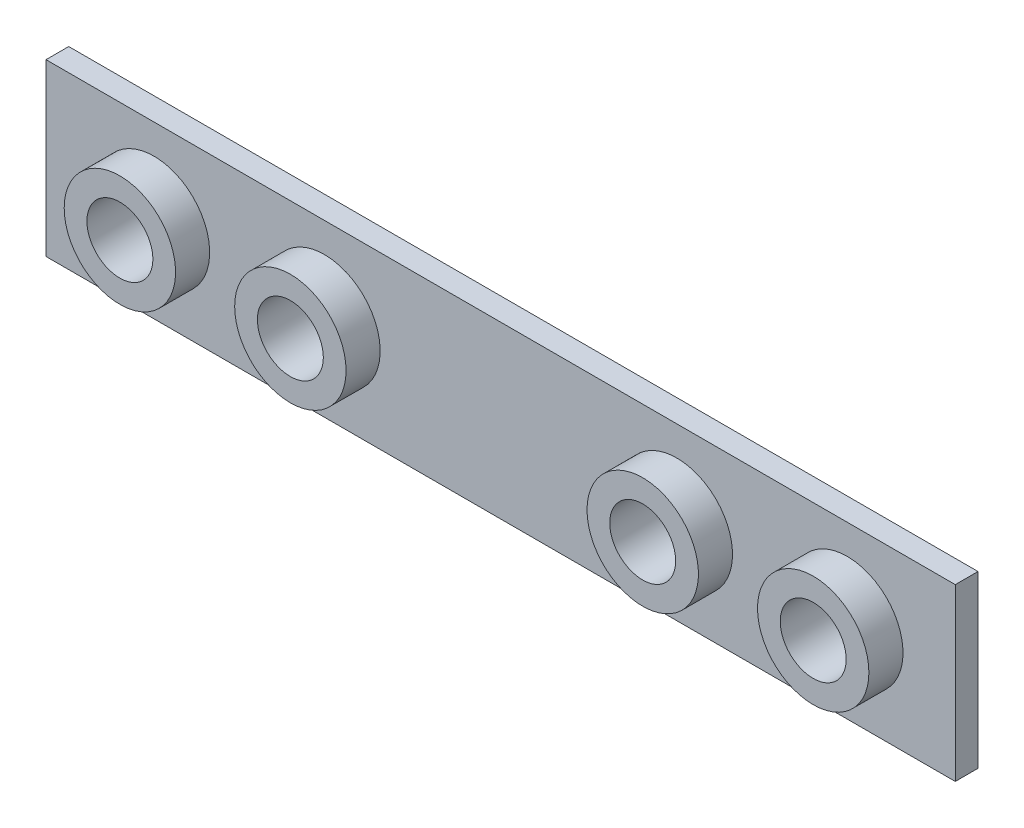
ISO-10303-21;
HEADER;
FILE_DESCRIPTION(('STEP AP214'),'2;1');
FILE_NAME('part.step','',(''),(''),'','','');
FILE_SCHEMA(('AUTOMOTIVE_DESIGN { 1 0 10303 214 1 1 1 1 }'));
ENDSEC;
DATA;
#1=APPLICATION_CONTEXT('core data for automotive mechanical design processes');
#2=APPLICATION_PROTOCOL_DEFINITION('international standard','automotive_design',2000,#1);
#3=PRODUCT_CONTEXT('',#1,'mechanical');
#4=PRODUCT('Part','Part','',(#3));
#5=PRODUCT_RELATED_PRODUCT_CATEGORY('part','',(#4));
#6=PRODUCT_DEFINITION_FORMATION('','',#4);
#7=PRODUCT_DEFINITION_CONTEXT('part definition',#1,'design');
#8=PRODUCT_DEFINITION('design','',#6,#7);
#9=PRODUCT_DEFINITION_SHAPE('','',#8);
#10=(LENGTH_UNIT() NAMED_UNIT(*) SI_UNIT(.MILLI.,.METRE.));
#11=(NAMED_UNIT(*) PLANE_ANGLE_UNIT() SI_UNIT($,.RADIAN.));
#12=(NAMED_UNIT(*) SI_UNIT($,.STERADIAN.) SOLID_ANGLE_UNIT());
#13=UNCERTAINTY_MEASURE_WITH_UNIT(LENGTH_MEASURE(1.E-05),#10,'distance_accuracy_value','');
#14=(GEOMETRIC_REPRESENTATION_CONTEXT(3) GLOBAL_UNCERTAINTY_ASSIGNED_CONTEXT((#13)) GLOBAL_UNIT_ASSIGNED_CONTEXT((#10,
#11,#12)) REPRESENTATION_CONTEXT('',''));
#15=CARTESIAN_POINT('',(0.,0.,0.));
#16=DIRECTION('',(0.,0.,1.));
#17=DIRECTION('',(1.,0.,0.));
#18=AXIS2_PLACEMENT_3D('',#15,#16,#17);
#19=CARTESIAN_POINT('',(-30.5,0.,5.));
#20=DIRECTION('',(0.,0.,-1.));
#21=DIRECTION('',(-1.,0.,0.));
#22=AXIS2_PLACEMENT_3D('',#19,#20,#21);
#23=CYLINDRICAL_SURFACE('',#22,4.9);
#24=CARTESIAN_POINT('',(-30.5,0.,5.));
#25=DIRECTION('',(0.,0.,1.));
#26=DIRECTION('',(-1.,0.,0.));
#27=AXIS2_PLACEMENT_3D('',#24,#25,#26);
#28=CIRCLE('',#27,4.9);
#29=CARTESIAN_POINT('',(-35.4,0.,5.));
#30=VERTEX_POINT('',#29);
#31=EDGE_CURVE('E42',#30,#30,#28,.T.);
#32=ORIENTED_EDGE('',*,*,#31,.F.);
#33=EDGE_LOOP('',(#32));
#34=FACE_BOUND('',#33,.T.);
#35=CARTESIAN_POINT('',(-30.5,0.,2.));
#36=DIRECTION('',(0.,0.,-1.));
#37=DIRECTION('',(-1.,0.,0.));
#38=AXIS2_PLACEMENT_3D('',#35,#36,#37);
#39=CIRCLE('',#38,4.9);
#40=CARTESIAN_POINT('',(-35.4,0.,2.));
#41=VERTEX_POINT('',#40);
#42=EDGE_CURVE('E131',#41,#41,#39,.T.);
#43=ORIENTED_EDGE('',*,*,#42,.F.);
#44=EDGE_LOOP('',(#43));
#45=FACE_BOUND('',#44,.T.);
#46=ADVANCED_FACE('F39',(#34,#45),#23,.T.);
#47=CARTESIAN_POINT('',(-30.5,0.,5.));
#48=DIRECTION('',(0.,0.,-1.));
#49=DIRECTION('',(-1.,0.,0.));
#50=AXIS2_PLACEMENT_3D('',#47,#48,#49);
#51=CYLINDRICAL_SURFACE('',#50,2.9);
#52=CARTESIAN_POINT('',(-30.5,0.,5.));
#53=DIRECTION('',(0.,0.,1.));
#54=DIRECTION('',(-1.,0.,0.));
#55=AXIS2_PLACEMENT_3D('',#52,#53,#54);
#56=CIRCLE('',#55,2.9);
#57=CARTESIAN_POINT('',(-33.4,0.,5.));
#58=VERTEX_POINT('',#57);
#59=EDGE_CURVE('E130',#58,#58,#56,.T.);
#60=ORIENTED_EDGE('',*,*,#59,.T.);
#61=EDGE_LOOP('',(#60));
#62=FACE_BOUND('',#61,.T.);
#63=CARTESIAN_POINT('',(-30.5,0.,0.));
#64=DIRECTION('',(0.,0.,1.));
#65=DIRECTION('',(1.,0.,0.));
#66=AXIS2_PLACEMENT_3D('',#63,#64,#65);
#67=CIRCLE('',#66,2.9);
#68=CARTESIAN_POINT('',(-27.6,0.,0.));
#69=VERTEX_POINT('',#68);
#70=EDGE_CURVE('E333',#69,#69,#67,.T.);
#71=ORIENTED_EDGE('',*,*,#70,.F.);
#72=EDGE_LOOP('',(#71));
#73=FACE_BOUND('',#72,.T.);
#74=ADVANCED_FACE('F148',(#62,#73),#51,.F.);
#75=CARTESIAN_POINT('',(-30.5,0.,5.));
#76=DIRECTION('',(0.,0.,-1.));
#77=DIRECTION('',(-1.,0.,0.));
#78=AXIS2_PLACEMENT_3D('',#75,#76,#77);
#79=PLANE('',#78);
#80=ORIENTED_EDGE('',*,*,#31,.T.);
#81=EDGE_LOOP('',(#80));
#82=FACE_BOUND('',#81,.T.);
#83=ORIENTED_EDGE('',*,*,#59,.F.);
#84=EDGE_LOOP('',(#83));
#85=FACE_BOUND('',#84,.T.);
#86=ADVANCED_FACE('F143',(#82,#85),#79,.F.);
#87=CARTESIAN_POINT('',(40.,-7.5,2.));
#88=DIRECTION('',(-1.,0.,0.));
#89=DIRECTION('',(0.,0.,1.));
#90=AXIS2_PLACEMENT_3D('',#87,#88,#89);
#91=PLANE('',#90);
#92=DIRECTION('',(0.,1.,0.));
#93=VECTOR('',#92,1.);
#94=CARTESIAN_POINT('',(40.,-7.5,0.));
#95=LINE('',#94,#93);
#96=CARTESIAN_POINT('',(40.,-7.5,0.));
#97=VERTEX_POINT('',#96);
#98=CARTESIAN_POINT('',(40.,7.5,0.));
#99=VERTEX_POINT('',#98);
#100=EDGE_CURVE('E113',#97,#99,#95,.T.);
#101=ORIENTED_EDGE('',*,*,#100,.T.);
#102=DIRECTION('',(0.,0.,-1.));
#103=VECTOR('',#102,1.);
#104=CARTESIAN_POINT('',(40.,7.5,2.));
#105=LINE('',#104,#103);
#106=CARTESIAN_POINT('',(40.,7.5,2.));
#107=VERTEX_POINT('',#106);
#108=EDGE_CURVE('E102',#107,#99,#105,.T.);
#109=ORIENTED_EDGE('',*,*,#108,.F.);
#110=DIRECTION('',(0.,1.,0.));
#111=VECTOR('',#110,1.);
#112=CARTESIAN_POINT('',(40.,-7.5,2.));
#113=LINE('',#112,#111);
#114=CARTESIAN_POINT('',(40.,-7.5,2.));
#115=VERTEX_POINT('',#114);
#116=EDGE_CURVE('E94',#115,#107,#113,.T.);
#117=ORIENTED_EDGE('',*,*,#116,.F.);
#118=DIRECTION('',(0.,0.,-1.));
#119=VECTOR('',#118,1.);
#120=CARTESIAN_POINT('',(40.,-7.5,2.));
#121=LINE('',#120,#119);
#122=EDGE_CURVE('E109',#115,#97,#121,.T.);
#123=ORIENTED_EDGE('',*,*,#122,.T.);
#124=EDGE_LOOP('',(#101,#109,#117,#123));
#125=FACE_BOUND('',#124,.T.);
#126=ADVANCED_FACE('F172',(#125),#91,.F.);
#127=CARTESIAN_POINT('',(-40.,7.5,2.));
#128=DIRECTION('',(0.,-1.,0.));
#129=DIRECTION('',(0.,0.,-1.));
#130=AXIS2_PLACEMENT_3D('',#127,#128,#129);
#131=PLANE('',#130);
#132=DIRECTION('',(-1.,0.,0.));
#133=VECTOR('',#132,1.);
#134=CARTESIAN_POINT('',(-40.,7.5,0.));
#135=LINE('',#134,#133);
#136=CARTESIAN_POINT('',(-40.,7.5,0.));
#137=VERTEX_POINT('',#136);
#138=EDGE_CURVE('E100',#99,#137,#135,.T.);
#139=ORIENTED_EDGE('',*,*,#138,.T.);
#140=DIRECTION('',(0.,0.,-1.));
#141=VECTOR('',#140,1.);
#142=CARTESIAN_POINT('',(-40.,7.5,2.));
#143=LINE('',#142,#141);
#144=CARTESIAN_POINT('',(-40.,7.5,2.));
#145=VERTEX_POINT('',#144);
#146=EDGE_CURVE('E98',#145,#137,#143,.T.);
#147=ORIENTED_EDGE('',*,*,#146,.F.);
#148=DIRECTION('',(-1.,0.,0.));
#149=VECTOR('',#148,1.);
#150=CARTESIAN_POINT('',(-40.,7.5,2.));
#151=LINE('',#150,#149);
#152=EDGE_CURVE('E89',#107,#145,#151,.T.);
#153=ORIENTED_EDGE('',*,*,#152,.F.);
#154=ORIENTED_EDGE('',*,*,#108,.T.);
#155=EDGE_LOOP('',(#139,#147,#153,#154));
#156=FACE_BOUND('',#155,.T.);
#157=ADVANCED_FACE('F99',(#156),#131,.F.);
#158=CARTESIAN_POINT('',(-40.,-7.5,2.));
#159=DIRECTION('',(1.,0.,0.));
#160=DIRECTION('',(0.,0.,-1.));
#161=AXIS2_PLACEMENT_3D('',#158,#159,#160);
#162=PLANE('',#161);
#163=DIRECTION('',(0.,-1.,0.));
#164=VECTOR('',#163,1.);
#165=CARTESIAN_POINT('',(-40.,-7.5,0.));
#166=LINE('',#165,#164);
#167=CARTESIAN_POINT('',(-40.,-7.5,0.));
#168=VERTEX_POINT('',#167);
#169=EDGE_CURVE('E75',#137,#168,#166,.T.);
#170=ORIENTED_EDGE('',*,*,#169,.T.);
#171=DIRECTION('',(0.,0.,-1.));
#172=VECTOR('',#171,1.);
#173=CARTESIAN_POINT('',(-40.,-7.5,2.));
#174=LINE('',#173,#172);
#175=CARTESIAN_POINT('',(-40.,-7.5,2.));
#176=VERTEX_POINT('',#175);
#177=EDGE_CURVE('E103',#176,#168,#174,.T.);
#178=ORIENTED_EDGE('',*,*,#177,.F.);
#179=DIRECTION('',(0.,-1.,0.));
#180=VECTOR('',#179,1.);
#181=CARTESIAN_POINT('',(-40.,-7.5,2.));
#182=LINE('',#181,#180);
#183=EDGE_CURVE('E92',#145,#176,#182,.T.);
#184=ORIENTED_EDGE('',*,*,#183,.F.);
#185=ORIENTED_EDGE('',*,*,#146,.T.);
#186=EDGE_LOOP('',(#170,#178,#184,#185));
#187=FACE_BOUND('',#186,.T.);
#188=ADVANCED_FACE('F105',(#187),#162,.F.);
#189=CARTESIAN_POINT('',(-40.,-7.5,2.));
#190=DIRECTION('',(0.,1.,0.));
#191=DIRECTION('',(0.,0.,1.));
#192=AXIS2_PLACEMENT_3D('',#189,#190,#191);
#193=PLANE('',#192);
#194=DIRECTION('',(1.,0.,0.));
#195=VECTOR('',#194,1.);
#196=CARTESIAN_POINT('',(-40.,-7.5,0.));
#197=LINE('',#196,#195);
#198=EDGE_CURVE('E81',#168,#97,#197,.T.);
#199=ORIENTED_EDGE('',*,*,#198,.T.);
#200=ORIENTED_EDGE('',*,*,#122,.F.);
#201=DIRECTION('',(1.,0.,0.));
#202=VECTOR('',#201,1.);
#203=CARTESIAN_POINT('',(-40.,-7.5,2.));
#204=LINE('',#203,#202);
#205=EDGE_CURVE('E58',#176,#115,#204,.T.);
#206=ORIENTED_EDGE('',*,*,#205,.F.);
#207=ORIENTED_EDGE('',*,*,#177,.T.);
#208=EDGE_LOOP('',(#199,#200,#206,#207));
#209=FACE_BOUND('',#208,.T.);
#210=ADVANCED_FACE('F153',(#209),#193,.F.);
#211=CARTESIAN_POINT('',(0.,0.,2.));
#212=DIRECTION('',(0.,0.,-1.));
#213=DIRECTION('',(-1.,0.,0.));
#214=AXIS2_PLACEMENT_3D('',#211,#212,#213);
#215=PLANE('',#214);
#216=CARTESIAN_POINT('',(30.5,0.,2.));
#217=DIRECTION('',(0.,0.,-1.));
#218=DIRECTION('',(-1.,0.,0.));
#219=AXIS2_PLACEMENT_3D('',#216,#217,#218);
#220=CIRCLE('',#219,4.9);
#221=CARTESIAN_POINT('',(25.6,0.,2.));
#222=VERTEX_POINT('',#221);
#223=EDGE_CURVE('E11',#222,#222,#220,.F.);
#224=ORIENTED_EDGE('',*,*,#223,.F.);
#225=EDGE_LOOP('',(#224));
#226=FACE_BOUND('',#225,.T.);
#227=CARTESIAN_POINT('',(15.5,0.,2.));
#228=DIRECTION('',(0.,0.,-1.));
#229=DIRECTION('',(-1.,0.,0.));
#230=AXIS2_PLACEMENT_3D('',#227,#228,#229);
#231=CIRCLE('',#230,4.9);
#232=CARTESIAN_POINT('',(10.6,0.,2.));
#233=VERTEX_POINT('',#232);
#234=EDGE_CURVE('E49',#233,#233,#231,.F.);
#235=ORIENTED_EDGE('',*,*,#234,.F.);
#236=EDGE_LOOP('',(#235));
#237=FACE_BOUND('',#236,.T.);
#238=CARTESIAN_POINT('',(-15.5,0.,2.));
#239=DIRECTION('',(0.,0.,-1.));
#240=DIRECTION('',(-1.,0.,0.));
#241=AXIS2_PLACEMENT_3D('',#238,#239,#240);
#242=CIRCLE('',#241,4.9);
#243=CARTESIAN_POINT('',(-20.4,0.,2.));
#244=VERTEX_POINT('',#243);
#245=EDGE_CURVE('E134',#244,#244,#242,.F.);
#246=ORIENTED_EDGE('',*,*,#245,.F.);
#247=EDGE_LOOP('',(#246));
#248=FACE_BOUND('',#247,.T.);
#249=ORIENTED_EDGE('',*,*,#42,.T.);
#250=EDGE_LOOP('',(#249));
#251=FACE_BOUND('',#250,.T.);
#252=ORIENTED_EDGE('',*,*,#116,.T.);
#253=ORIENTED_EDGE('',*,*,#152,.T.);
#254=ORIENTED_EDGE('',*,*,#183,.T.);
#255=ORIENTED_EDGE('',*,*,#205,.T.);
#256=EDGE_LOOP('',(#252,#253,#254,#255));
#257=FACE_BOUND('',#256,.T.);
#258=ADVANCED_FACE('F90',(#226,#237,#248,#251,#257),#215,.F.);
#259=CARTESIAN_POINT('',(-30.5,0.,0.));
#260=DIRECTION('',(0.,0.,-1.));
#261=DIRECTION('',(-1.,0.,0.));
#262=AXIS2_PLACEMENT_3D('',#259,#260,#261);
#263=PLANE('',#262);
#264=ORIENTED_EDGE('',*,*,#70,.T.);
#265=EDGE_LOOP('',(#264));
#266=FACE_BOUND('',#265,.T.);
#267=CARTESIAN_POINT('',(-15.5,0.,0.));
#268=DIRECTION('',(0.,0.,1.));
#269=DIRECTION('',(1.,0.,0.));
#270=AXIS2_PLACEMENT_3D('',#267,#268,#269);
#271=CIRCLE('',#270,2.9);
#272=CARTESIAN_POINT('',(-12.6,0.,0.));
#273=VERTEX_POINT('',#272);
#274=EDGE_CURVE('E326',#273,#273,#271,.T.);
#275=ORIENTED_EDGE('',*,*,#274,.T.);
#276=EDGE_LOOP('',(#275));
#277=FACE_BOUND('',#276,.T.);
#278=CARTESIAN_POINT('',(15.5,0.,0.));
#279=DIRECTION('',(0.,0.,1.));
#280=DIRECTION('',(1.,0.,0.));
#281=AXIS2_PLACEMENT_3D('',#278,#279,#280);
#282=CIRCLE('',#281,2.9);
#283=CARTESIAN_POINT('',(18.4,0.,0.));
#284=VERTEX_POINT('',#283);
#285=EDGE_CURVE('E322',#284,#284,#282,.T.);
#286=ORIENTED_EDGE('',*,*,#285,.T.);
#287=EDGE_LOOP('',(#286));
#288=FACE_BOUND('',#287,.T.);
#289=CARTESIAN_POINT('',(30.5,0.,0.));
#290=DIRECTION('',(0.,0.,1.));
#291=DIRECTION('',(1.,0.,0.));
#292=AXIS2_PLACEMENT_3D('',#289,#290,#291);
#293=CIRCLE('',#292,2.9);
#294=CARTESIAN_POINT('',(33.4,0.,0.));
#295=VERTEX_POINT('',#294);
#296=EDGE_CURVE('E319',#295,#295,#293,.T.);
#297=ORIENTED_EDGE('',*,*,#296,.T.);
#298=EDGE_LOOP('',(#297));
#299=FACE_BOUND('',#298,.T.);
#300=ORIENTED_EDGE('',*,*,#100,.F.);
#301=ORIENTED_EDGE('',*,*,#198,.F.);
#302=ORIENTED_EDGE('',*,*,#169,.F.);
#303=ORIENTED_EDGE('',*,*,#138,.F.);
#304=EDGE_LOOP('',(#300,#301,#302,#303));
#305=FACE_BOUND('',#304,.T.);
#306=ADVANCED_FACE('F152',(#266,#277,#288,#299,#305),#263,.T.);
#307=CARTESIAN_POINT('',(-15.5,0.,5.));
#308=DIRECTION('',(0.,0.,-1.));
#309=DIRECTION('',(-1.,0.,0.));
#310=AXIS2_PLACEMENT_3D('',#307,#308,#309);
#311=CYLINDRICAL_SURFACE('',#310,4.9);
#312=CARTESIAN_POINT('',(-15.5,0.,5.));
#313=DIRECTION('',(0.,0.,1.));
#314=DIRECTION('',(1.,0.,0.));
#315=AXIS2_PLACEMENT_3D('',#312,#313,#314);
#316=CIRCLE('',#315,4.9);
#317=CARTESIAN_POINT('',(-10.6,0.,5.));
#318=VERTEX_POINT('',#317);
#319=EDGE_CURVE('E117',#318,#318,#316,.T.);
#320=ORIENTED_EDGE('',*,*,#319,.F.);
#321=EDGE_LOOP('',(#320));
#322=FACE_BOUND('',#321,.T.);
#323=ORIENTED_EDGE('',*,*,#245,.T.);
#324=EDGE_LOOP('',(#323));
#325=FACE_BOUND('',#324,.T.);
#326=ADVANCED_FACE('F160',(#322,#325),#311,.T.);
#327=CARTESIAN_POINT('',(-15.5,0.,5.));
#328=DIRECTION('',(0.,0.,-1.));
#329=DIRECTION('',(-1.,0.,0.));
#330=AXIS2_PLACEMENT_3D('',#327,#328,#329);
#331=CYLINDRICAL_SURFACE('',#330,2.9);
#332=CARTESIAN_POINT('',(-15.5,0.,5.));
#333=DIRECTION('',(0.,0.,1.));
#334=DIRECTION('',(1.,0.,0.));
#335=AXIS2_PLACEMENT_3D('',#332,#333,#334);
#336=CIRCLE('',#335,2.9);
#337=CARTESIAN_POINT('',(-12.6,0.,5.));
#338=VERTEX_POINT('',#337);
#339=EDGE_CURVE('E345',#338,#338,#336,.T.);
#340=ORIENTED_EDGE('',*,*,#339,.T.);
#341=EDGE_LOOP('',(#340));
#342=FACE_BOUND('',#341,.T.);
#343=ORIENTED_EDGE('',*,*,#274,.F.);
#344=EDGE_LOOP('',(#343));
#345=FACE_BOUND('',#344,.T.);
#346=ADVANCED_FACE('F214',(#342,#345),#331,.F.);
#347=CARTESIAN_POINT('',(-15.5,0.,5.));
#348=DIRECTION('',(0.,0.,1.));
#349=DIRECTION('',(1.,0.,0.));
#350=AXIS2_PLACEMENT_3D('',#347,#348,#349);
#351=PLANE('',#350);
#352=ORIENTED_EDGE('',*,*,#319,.T.);
#353=EDGE_LOOP('',(#352));
#354=FACE_BOUND('',#353,.T.);
#355=ORIENTED_EDGE('',*,*,#339,.F.);
#356=EDGE_LOOP('',(#355));
#357=FACE_BOUND('',#356,.T.);
#358=ADVANCED_FACE('F222',(#354,#357),#351,.T.);
#359=CARTESIAN_POINT('',(15.5,0.,5.));
#360=DIRECTION('',(0.,0.,-1.));
#361=DIRECTION('',(-1.,0.,0.));
#362=AXIS2_PLACEMENT_3D('',#359,#360,#361);
#363=CYLINDRICAL_SURFACE('',#362,4.9);
#364=CARTESIAN_POINT('',(15.5,0.,5.));
#365=DIRECTION('',(0.,0.,1.));
#366=DIRECTION('',(-1.,0.,0.));
#367=AXIS2_PLACEMENT_3D('',#364,#365,#366);
#368=CIRCLE('',#367,4.9);
#369=CARTESIAN_POINT('',(10.6,0.,5.));
#370=VERTEX_POINT('',#369);
#371=EDGE_CURVE('E341',#370,#370,#368,.T.);
#372=ORIENTED_EDGE('',*,*,#371,.F.);
#373=EDGE_LOOP('',(#372));
#374=FACE_BOUND('',#373,.T.);
#375=ORIENTED_EDGE('',*,*,#234,.T.);
#376=EDGE_LOOP('',(#375));
#377=FACE_BOUND('',#376,.T.);
#378=ADVANCED_FACE('F227',(#374,#377),#363,.T.);
#379=CARTESIAN_POINT('',(15.5,0.,5.));
#380=DIRECTION('',(0.,0.,-1.));
#381=DIRECTION('',(-1.,0.,0.));
#382=AXIS2_PLACEMENT_3D('',#379,#380,#381);
#383=CYLINDRICAL_SURFACE('',#382,2.9);
#384=CARTESIAN_POINT('',(15.5,0.,5.));
#385=DIRECTION('',(0.,0.,1.));
#386=DIRECTION('',(-1.,0.,0.));
#387=AXIS2_PLACEMENT_3D('',#384,#385,#386);
#388=CIRCLE('',#387,2.9);
#389=CARTESIAN_POINT('',(12.6,0.,5.));
#390=VERTEX_POINT('',#389);
#391=EDGE_CURVE('E336',#390,#390,#388,.T.);
#392=ORIENTED_EDGE('',*,*,#391,.T.);
#393=EDGE_LOOP('',(#392));
#394=FACE_BOUND('',#393,.T.);
#395=ORIENTED_EDGE('',*,*,#285,.F.);
#396=EDGE_LOOP('',(#395));
#397=FACE_BOUND('',#396,.T.);
#398=ADVANCED_FACE('F236',(#394,#397),#383,.F.);
#399=CARTESIAN_POINT('',(15.5,0.,5.));
#400=DIRECTION('',(0.,0.,-1.));
#401=DIRECTION('',(-1.,0.,0.));
#402=AXIS2_PLACEMENT_3D('',#399,#400,#401);
#403=PLANE('',#402);
#404=ORIENTED_EDGE('',*,*,#371,.T.);
#405=EDGE_LOOP('',(#404));
#406=FACE_BOUND('',#405,.T.);
#407=ORIENTED_EDGE('',*,*,#391,.F.);
#408=EDGE_LOOP('',(#407));
#409=FACE_BOUND('',#408,.T.);
#410=ADVANCED_FACE('F244',(#406,#409),#403,.F.);
#411=CARTESIAN_POINT('',(30.5,0.,5.));
#412=DIRECTION('',(0.,0.,-1.));
#413=DIRECTION('',(-1.,0.,0.));
#414=AXIS2_PLACEMENT_3D('',#411,#412,#413);
#415=CYLINDRICAL_SURFACE('',#414,4.9);
#416=CARTESIAN_POINT('',(30.5,0.,5.));
#417=DIRECTION('',(0.,0.,1.));
#418=DIRECTION('',(1.,0.,0.));
#419=AXIS2_PLACEMENT_3D('',#416,#417,#418);
#420=CIRCLE('',#419,4.9);
#421=CARTESIAN_POINT('',(35.4,0.,5.));
#422=VERTEX_POINT('',#421);
#423=EDGE_CURVE('E332',#422,#422,#420,.T.);
#424=ORIENTED_EDGE('',*,*,#423,.F.);
#425=EDGE_LOOP('',(#424));
#426=FACE_BOUND('',#425,.T.);
#427=ORIENTED_EDGE('',*,*,#223,.T.);
#428=EDGE_LOOP('',(#427));
#429=FACE_BOUND('',#428,.T.);
#430=ADVANCED_FACE('F249',(#426,#429),#415,.T.);
#431=CARTESIAN_POINT('',(30.5,0.,5.));
#432=DIRECTION('',(0.,0.,-1.));
#433=DIRECTION('',(-1.,0.,0.));
#434=AXIS2_PLACEMENT_3D('',#431,#432,#433);
#435=CYLINDRICAL_SURFACE('',#434,2.9);
#436=CARTESIAN_POINT('',(30.5,0.,5.));
#437=DIRECTION('',(0.,0.,1.));
#438=DIRECTION('',(1.,0.,0.));
#439=AXIS2_PLACEMENT_3D('',#436,#437,#438);
#440=CIRCLE('',#439,2.9);
#441=CARTESIAN_POINT('',(33.4,0.,5.));
#442=VERTEX_POINT('',#441);
#443=EDGE_CURVE('E316',#442,#442,#440,.T.);
#444=ORIENTED_EDGE('',*,*,#443,.T.);
#445=EDGE_LOOP('',(#444));
#446=FACE_BOUND('',#445,.T.);
#447=ORIENTED_EDGE('',*,*,#296,.F.);
#448=EDGE_LOOP('',(#447));
#449=FACE_BOUND('',#448,.T.);
#450=ADVANCED_FACE('F259',(#446,#449),#435,.F.);
#451=CARTESIAN_POINT('',(30.5,0.,5.));
#452=DIRECTION('',(0.,0.,1.));
#453=DIRECTION('',(1.,0.,0.));
#454=AXIS2_PLACEMENT_3D('',#451,#452,#453);
#455=PLANE('',#454);
#456=ORIENTED_EDGE('',*,*,#423,.T.);
#457=EDGE_LOOP('',(#456));
#458=FACE_BOUND('',#457,.T.);
#459=ORIENTED_EDGE('',*,*,#443,.F.);
#460=EDGE_LOOP('',(#459));
#461=FACE_BOUND('',#460,.T.);
#462=ADVANCED_FACE('F267',(#458,#461),#455,.T.);
#463=CLOSED_SHELL('',(#46,#74,#86,#126,#157,#188,#210,#258,#306,#326,#346,#358,#378,#398,#410,
#430,#450,#462));
#464=MANIFOLD_SOLID_BREP('B2',#463);
#465=ADVANCED_BREP_SHAPE_REPRESENTATION('',(#18,#464),#14);
#466=SHAPE_DEFINITION_REPRESENTATION(#9,#465);
ENDSEC;
END-ISO-10303-21;
